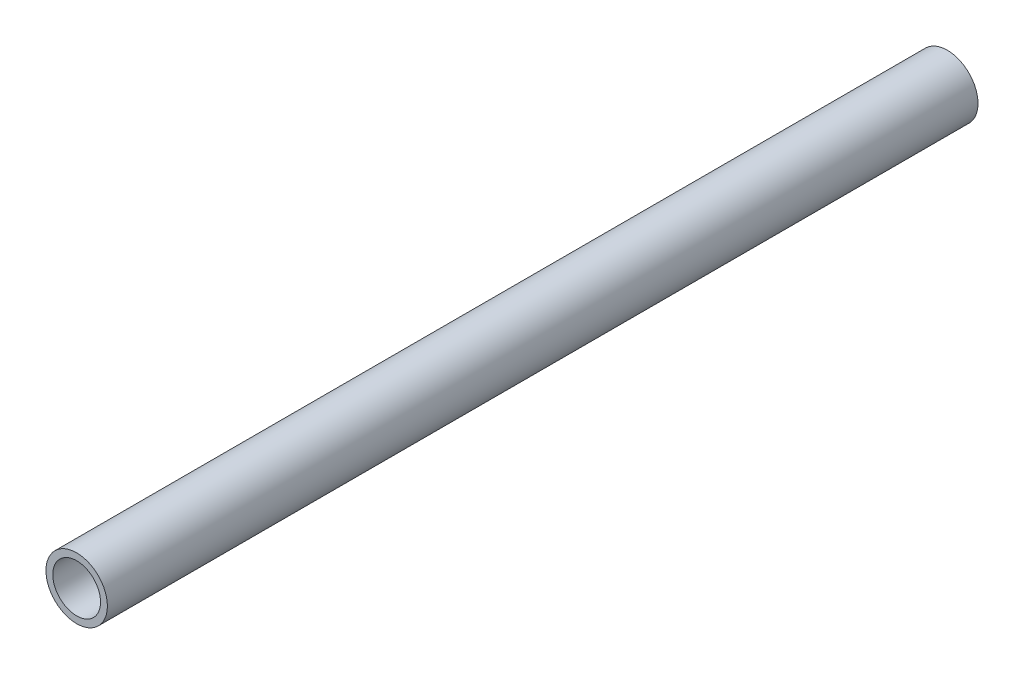
ISO-10303-21;
HEADER;
FILE_DESCRIPTION(('STEP AP214'),'2;1');
FILE_NAME('part.step','',(''),(''),'','','');
FILE_SCHEMA(('AUTOMOTIVE_DESIGN { 1 0 10303 214 1 1 1 1 }'));
ENDSEC;
DATA;
#1=APPLICATION_CONTEXT('core data for automotive mechanical design processes');
#2=APPLICATION_PROTOCOL_DEFINITION('international standard','automotive_design',2000,#1);
#3=PRODUCT_CONTEXT('',#1,'mechanical');
#4=PRODUCT('Part','Part','',(#3));
#5=PRODUCT_RELATED_PRODUCT_CATEGORY('part','',(#4));
#6=PRODUCT_DEFINITION_FORMATION('','',#4);
#7=PRODUCT_DEFINITION_CONTEXT('part definition',#1,'design');
#8=PRODUCT_DEFINITION('design','',#6,#7);
#9=PRODUCT_DEFINITION_SHAPE('','',#8);
#10=(LENGTH_UNIT() NAMED_UNIT(*) SI_UNIT(.MILLI.,.METRE.));
#11=(NAMED_UNIT(*) PLANE_ANGLE_UNIT() SI_UNIT($,.RADIAN.));
#12=(NAMED_UNIT(*) SI_UNIT($,.STERADIAN.) SOLID_ANGLE_UNIT());
#13=UNCERTAINTY_MEASURE_WITH_UNIT(LENGTH_MEASURE(1.E-05),#10,'distance_accuracy_value','');
#14=(GEOMETRIC_REPRESENTATION_CONTEXT(3) GLOBAL_UNCERTAINTY_ASSIGNED_CONTEXT((#13)) GLOBAL_UNIT_ASSIGNED_CONTEXT((#10,
#11,#12)) REPRESENTATION_CONTEXT('',''));
#15=CARTESIAN_POINT('',(0.,0.,0.));
#16=DIRECTION('',(0.,0.,1.));
#17=DIRECTION('',(1.,0.,0.));
#18=AXIS2_PLACEMENT_3D('',#15,#16,#17);
#19=CARTESIAN_POINT('',(0.,0.,255.08));
#20=DIRECTION('',(0.,0.,1.));
#21=DIRECTION('',(1.,0.,0.));
#22=AXIS2_PLACEMENT_3D('',#19,#20,#21);
#23=PLANE('',#22);
#24=CARTESIAN_POINT('',(0.,0.,255.08));
#25=DIRECTION('',(0.,0.,1.));
#26=DIRECTION('',(1.,0.,0.));
#27=AXIS2_PLACEMENT_3D('',#24,#25,#26);
#28=CIRCLE('',#27,9.);
#29=CARTESIAN_POINT('',(9.,0.,255.08));
#30=VERTEX_POINT('',#29);
#31=EDGE_CURVE('E10',#30,#30,#28,.T.);
#32=ORIENTED_EDGE('',*,*,#31,.T.);
#33=EDGE_LOOP('',(#32));
#34=FACE_BOUND('',#33,.T.);
#35=CARTESIAN_POINT('',(0.,0.,255.08));
#36=DIRECTION('',(0.,0.,1.));
#37=DIRECTION('',(1.,0.,0.));
#38=AXIS2_PLACEMENT_3D('',#35,#36,#37);
#39=CIRCLE('',#38,7.);
#40=CARTESIAN_POINT('',(7.,0.,255.08));
#41=VERTEX_POINT('',#40);
#42=EDGE_CURVE('E44',#41,#41,#39,.T.);
#43=ORIENTED_EDGE('',*,*,#42,.F.);
#44=EDGE_LOOP('',(#43));
#45=FACE_BOUND('',#44,.T.);
#46=ADVANCED_FACE('F33',(#34,#45),#23,.T.);
#47=CARTESIAN_POINT('',(0.,0.,0.));
#48=DIRECTION('',(0.,0.,1.));
#49=DIRECTION('',(1.,0.,0.));
#50=AXIS2_PLACEMENT_3D('',#47,#48,#49);
#51=PLANE('',#50);
#52=CARTESIAN_POINT('',(0.,0.,0.));
#53=DIRECTION('',(0.,0.,1.));
#54=DIRECTION('',(1.,0.,0.));
#55=AXIS2_PLACEMENT_3D('',#52,#53,#54);
#56=CIRCLE('',#55,9.);
#57=CARTESIAN_POINT('',(9.,0.,0.));
#58=VERTEX_POINT('',#57);
#59=EDGE_CURVE('E37',#58,#58,#56,.T.);
#60=ORIENTED_EDGE('',*,*,#59,.F.);
#61=EDGE_LOOP('',(#60));
#62=FACE_BOUND('',#61,.T.);
#63=CARTESIAN_POINT('',(0.,0.,0.));
#64=DIRECTION('',(0.,0.,1.));
#65=DIRECTION('',(1.,0.,0.));
#66=AXIS2_PLACEMENT_3D('',#63,#64,#65);
#67=CIRCLE('',#66,7.);
#68=CARTESIAN_POINT('',(7.,0.,0.));
#69=VERTEX_POINT('',#68);
#70=EDGE_CURVE('E46',#69,#69,#67,.T.);
#71=ORIENTED_EDGE('',*,*,#70,.T.);
#72=EDGE_LOOP('',(#71));
#73=FACE_BOUND('',#72,.T.);
#74=ADVANCED_FACE('F56',(#62,#73),#51,.F.);
#75=CARTESIAN_POINT('',(0.,0.,255.08));
#76=DIRECTION('',(0.,0.,-1.));
#77=DIRECTION('',(-1.,0.,0.));
#78=AXIS2_PLACEMENT_3D('',#75,#76,#77);
#79=CYLINDRICAL_SURFACE('',#78,9.);
#80=ORIENTED_EDGE('',*,*,#31,.F.);
#81=EDGE_LOOP('',(#80));
#82=FACE_BOUND('',#81,.T.);
#83=ORIENTED_EDGE('',*,*,#59,.T.);
#84=EDGE_LOOP('',(#83));
#85=FACE_BOUND('',#84,.T.);
#86=ADVANCED_FACE('F35',(#82,#85),#79,.T.);
#87=CARTESIAN_POINT('',(0.,0.,255.08));
#88=DIRECTION('',(0.,0.,-1.));
#89=DIRECTION('',(-1.,0.,0.));
#90=AXIS2_PLACEMENT_3D('',#87,#88,#89);
#91=CYLINDRICAL_SURFACE('',#90,7.);
#92=ORIENTED_EDGE('',*,*,#42,.T.);
#93=EDGE_LOOP('',(#92));
#94=FACE_BOUND('',#93,.T.);
#95=ORIENTED_EDGE('',*,*,#70,.F.);
#96=EDGE_LOOP('',(#95));
#97=FACE_BOUND('',#96,.T.);
#98=ADVANCED_FACE('F52',(#94,#97),#91,.F.);
#99=CLOSED_SHELL('',(#46,#74,#86,#98));
#100=MANIFOLD_SOLID_BREP('B2',#99);
#101=ADVANCED_BREP_SHAPE_REPRESENTATION('',(#18,#100),#14);
#102=SHAPE_DEFINITION_REPRESENTATION(#9,#101);
ENDSEC;
END-ISO-10303-21;
